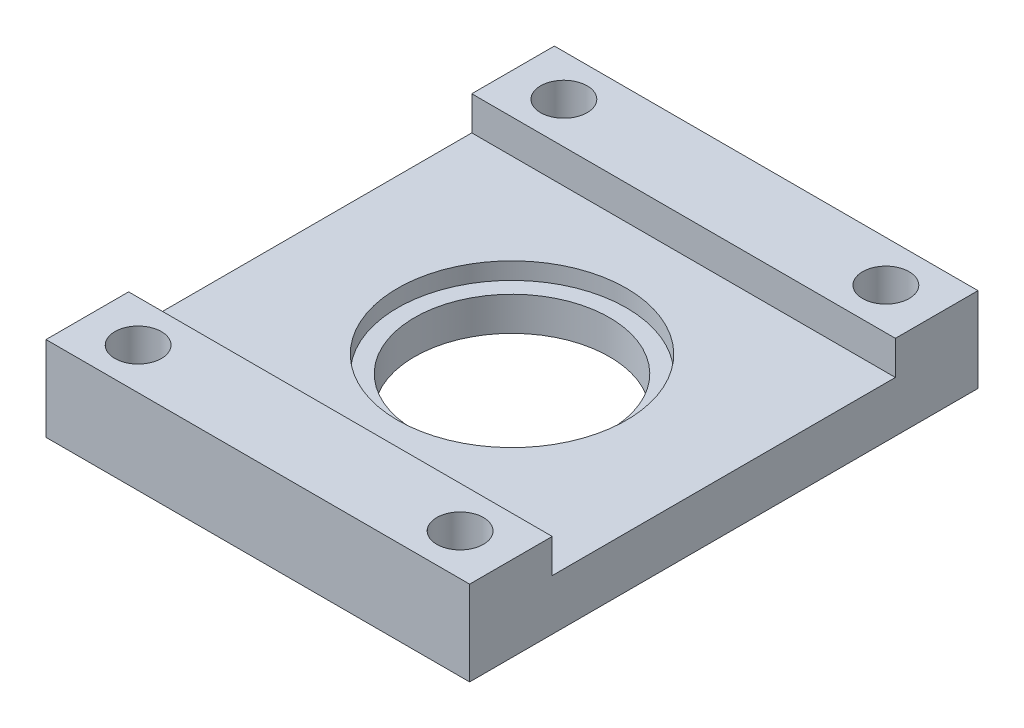
ISO-10303-21;
HEADER;
FILE_DESCRIPTION(('STEP AP214'),'2;1');
FILE_NAME('part.step','',(''),(''),'','','');
FILE_SCHEMA(('AUTOMOTIVE_DESIGN { 1 0 10303 214 1 1 1 1 }'));
ENDSEC;
DATA;
#1=APPLICATION_CONTEXT('core data for automotive mechanical design processes');
#2=APPLICATION_PROTOCOL_DEFINITION('international standard','automotive_design',2000,#1);
#3=PRODUCT_CONTEXT('',#1,'mechanical');
#4=PRODUCT('Part','Part','',(#3));
#5=PRODUCT_RELATED_PRODUCT_CATEGORY('part','',(#4));
#6=PRODUCT_DEFINITION_FORMATION('','',#4);
#7=PRODUCT_DEFINITION_CONTEXT('part definition',#1,'design');
#8=PRODUCT_DEFINITION('design','',#6,#7);
#9=PRODUCT_DEFINITION_SHAPE('','',#8);
#10=(LENGTH_UNIT() NAMED_UNIT(*) SI_UNIT(.MILLI.,.METRE.));
#11=(NAMED_UNIT(*) PLANE_ANGLE_UNIT() SI_UNIT($,.RADIAN.));
#12=(NAMED_UNIT(*) SI_UNIT($,.STERADIAN.) SOLID_ANGLE_UNIT());
#13=UNCERTAINTY_MEASURE_WITH_UNIT(LENGTH_MEASURE(1.E-05),#10,'distance_accuracy_value','');
#14=(GEOMETRIC_REPRESENTATION_CONTEXT(3) GLOBAL_UNCERTAINTY_ASSIGNED_CONTEXT((#13)) GLOBAL_UNIT_ASSIGNED_CONTEXT((#10,
#11,#12)) REPRESENTATION_CONTEXT('',''));
#15=CARTESIAN_POINT('',(0.,0.,0.));
#16=DIRECTION('',(0.,0.,1.));
#17=DIRECTION('',(1.,0.,0.));
#18=AXIS2_PLACEMENT_3D('',#15,#16,#17);
#19=CARTESIAN_POINT('',(31.75,0.,38.1));
#20=DIRECTION('',(0.,1.,0.));
#21=DIRECTION('',(0.,0.,1.));
#22=AXIS2_PLACEMENT_3D('',#19,#20,#21);
#23=CYLINDRICAL_SURFACE('',#22,14.605);
#24=CARTESIAN_POINT('',(31.75,0.,38.1));
#25=DIRECTION('',(0.,1.,0.));
#26=DIRECTION('',(0.,0.,1.));
#27=AXIS2_PLACEMENT_3D('',#24,#25,#26);
#28=CIRCLE('',#27,14.605);
#29=CARTESIAN_POINT('',(31.75,0.,52.705));
#30=VERTEX_POINT('',#29);
#31=EDGE_CURVE('E179',#30,#30,#28,.T.);
#32=CARTESIAN_POINT('',(31.75,5.08,38.1));
#33=DIRECTION('',(0.,1.,0.));
#34=DIRECTION('',(0.,0.,1.));
#35=AXIS2_PLACEMENT_3D('',#32,#33,#34);
#36=CIRCLE('',#35,14.605);
#37=CARTESIAN_POINT('',(31.75,5.08,52.705));
#38=VERTEX_POINT('',#37);
#39=EDGE_CURVE('E41',#38,#38,#36,.F.);
#40=CARTESIAN_POINT('',(31.75,0.,52.705));
#41=CARTESIAN_POINT('',(31.75,0.0529166666666667,52.705));
#42=CARTESIAN_POINT('',(31.75,0.105833333333333,52.705));
#43=CARTESIAN_POINT('',(31.75,0.211666666666667,52.705));
#44=CARTESIAN_POINT('',(31.75,0.264583333333333,52.705));
#45=CARTESIAN_POINT('',(31.75,0.370416666666667,52.705));
#46=CARTESIAN_POINT('',(31.75,0.423333333333333,52.705));
#47=CARTESIAN_POINT('',(31.75,0.529166666666666,52.705));
#48=CARTESIAN_POINT('',(31.75,0.582083333333333,52.705));
#49=CARTESIAN_POINT('',(31.75,0.687916666666667,52.705));
#50=CARTESIAN_POINT('',(31.75,0.740833333333333,52.705));
#51=CARTESIAN_POINT('',(31.75,0.846666666666666,52.705));
#52=CARTESIAN_POINT('',(31.75,0.899583333333333,52.705));
#53=CARTESIAN_POINT('',(31.75,1.00541666666667,52.705));
#54=CARTESIAN_POINT('',(31.75,1.05833333333333,52.705));
#55=CARTESIAN_POINT('',(31.75,1.16416666666667,52.705));
#56=CARTESIAN_POINT('',(31.75,1.21708333333333,52.705));
#57=CARTESIAN_POINT('',(31.75,1.32291666666667,52.705));
#58=CARTESIAN_POINT('',(31.75,1.37583333333333,52.705));
#59=CARTESIAN_POINT('',(31.75,1.48166666666667,52.705));
#60=CARTESIAN_POINT('',(31.75,1.53458333333333,52.705));
#61=CARTESIAN_POINT('',(31.75,1.64041666666667,52.705));
#62=CARTESIAN_POINT('',(31.75,1.69333333333333,52.705));
#63=CARTESIAN_POINT('',(31.75,1.79916666666667,52.705));
#64=CARTESIAN_POINT('',(31.75,1.85208333333333,52.705));
#65=CARTESIAN_POINT('',(31.75,1.95791666666667,52.705));
#66=CARTESIAN_POINT('',(31.75,2.01083333333333,52.705));
#67=CARTESIAN_POINT('',(31.75,2.11666666666667,52.705));
#68=CARTESIAN_POINT('',(31.75,2.16958333333333,52.705));
#69=CARTESIAN_POINT('',(31.75,2.27541666666667,52.705));
#70=CARTESIAN_POINT('',(31.75,2.32833333333333,52.705));
#71=CARTESIAN_POINT('',(31.75,2.43416666666667,52.705));
#72=CARTESIAN_POINT('',(31.75,2.48708333333333,52.705));
#73=CARTESIAN_POINT('',(31.75,2.59291666666667,52.705));
#74=CARTESIAN_POINT('',(31.75,2.64583333333333,52.705));
#75=CARTESIAN_POINT('',(31.75,2.75166666666667,52.705));
#76=CARTESIAN_POINT('',(31.75,2.80458333333333,52.705));
#77=CARTESIAN_POINT('',(31.75,2.91041666666667,52.705));
#78=CARTESIAN_POINT('',(31.75,2.96333333333333,52.705));
#79=CARTESIAN_POINT('',(31.75,3.06916666666667,52.705));
#80=CARTESIAN_POINT('',(31.75,3.12208333333333,52.705));
#81=CARTESIAN_POINT('',(31.75,3.22791666666667,52.705));
#82=CARTESIAN_POINT('',(31.75,3.28083333333333,52.705));
#83=CARTESIAN_POINT('',(31.75,3.38666666666667,52.705));
#84=CARTESIAN_POINT('',(31.75,3.43958333333333,52.705));
#85=CARTESIAN_POINT('',(31.75,3.54541666666667,52.705));
#86=CARTESIAN_POINT('',(31.75,3.59833333333333,52.705));
#87=CARTESIAN_POINT('',(31.75,3.70416666666667,52.705));
#88=CARTESIAN_POINT('',(31.75,3.75708333333333,52.705));
#89=CARTESIAN_POINT('',(31.75,3.86291666666667,52.705));
#90=CARTESIAN_POINT('',(31.75,3.91583333333333,52.705));
#91=CARTESIAN_POINT('',(31.75,4.02166666666666,52.705));
#92=CARTESIAN_POINT('',(31.75,4.07458333333333,52.705));
#93=CARTESIAN_POINT('',(31.75,4.18041666666667,52.705));
#94=CARTESIAN_POINT('',(31.75,4.23333333333333,52.705));
#95=CARTESIAN_POINT('',(31.75,4.33916666666666,52.705));
#96=CARTESIAN_POINT('',(31.75,4.39208333333333,52.705));
#97=CARTESIAN_POINT('',(31.75,4.49791666666667,52.705));
#98=CARTESIAN_POINT('',(31.75,4.55083333333333,52.705));
#99=CARTESIAN_POINT('',(31.75,4.65666666666666,52.705));
#100=CARTESIAN_POINT('',(31.75,4.70958333333333,52.705));
#101=CARTESIAN_POINT('',(31.75,4.81541666666666,52.705));
#102=CARTESIAN_POINT('',(31.75,4.86833333333333,52.705));
#103=CARTESIAN_POINT('',(31.75,4.97416666666667,52.705));
#104=CARTESIAN_POINT('',(31.75,5.02708333333333,52.705));
#105=CARTESIAN_POINT('',(31.75,5.08,52.705));
#106=B_SPLINE_CURVE_WITH_KNOTS('',3,(#40,#41,#42,#43,#44,#45,#46,#47,#48,#49,#50,#51,#52,#53,
#54,#55,#56,#57,#58,#59,#60,#61,#62,#63,#64,#65,#66,#67,#68,#69,#70,#71,#72,#73,#74,#75,#76,#77,
#78,#79,#80,#81,#82,#83,#84,#85,#86,#87,#88,#89,#90,#91,#92,#93,#94,#95,#96,#97,#98,#99,#100,
#101,#102,#103,#104,#105),.UNSPECIFIED.,.F.,.F.,(4,2,2,2,2,2,2,2,2,2,2,2,2,2,2,2,2,2,2,2,2,2,2,
2,2,2,2,2,2,2,2,2,4),(0.,0.15875,0.3175,0.47625,0.635,0.79375,0.9525,1.11125,1.27,1.42875,
1.5875,1.74625,1.905,2.06375,2.2225,2.38125,2.54,2.69875,2.8575,3.01625,3.175,3.33375,3.4925,
3.65125,3.81,3.96875,4.1275,4.28625,4.445,4.60375,4.7625,4.92125,5.08),.UNSPECIFIED.);
#107=EDGE_CURVE('BSEAM37',#30,#38,#106,.T.);
#108=ORIENTED_EDGE('',*,*,#31,.F.);
#109=ORIENTED_EDGE('',*,*,#39,.F.);
#110=ORIENTED_EDGE('',*,*,#107,.T.);
#111=ORIENTED_EDGE('',*,*,#107,.F.);
#112=EDGE_LOOP('',(#108,#110,#109,#111));
#113=FACE_BOUND('',#112,.T.);
#114=ADVANCED_FACE('F37',(#113),#23,.F.);
#115=CARTESIAN_POINT('',(0.,12.7,0.));
#116=DIRECTION('',(0.,1.,0.));
#117=DIRECTION('',(0.,0.,1.));
#118=AXIS2_PLACEMENT_3D('',#115,#116,#117);
#119=PLANE('',#118);
#120=CARTESIAN_POINT('',(55.88,12.7,6.19125));
#121=DIRECTION('',(0.,1.,0.));
#122=DIRECTION('',(0.,0.,1.));
#123=AXIS2_PLACEMENT_3D('',#120,#121,#122);
#124=CIRCLE('',#123,3.49250000000001);
#125=CARTESIAN_POINT('',(55.88,12.7,9.68375000000001));
#126=VERTEX_POINT('',#125);
#127=EDGE_CURVE('E230',#126,#126,#124,.T.);
#128=ORIENTED_EDGE('',*,*,#127,.F.);
#129=EDGE_LOOP('',(#128));
#130=FACE_BOUND('',#129,.T.);
#131=CARTESIAN_POINT('',(7.62,12.7,6.19125));
#132=DIRECTION('',(0.,1.,0.));
#133=DIRECTION('',(0.,0.,1.));
#134=AXIS2_PLACEMENT_3D('',#131,#132,#133);
#135=CIRCLE('',#134,3.4925);
#136=CARTESIAN_POINT('',(7.62,12.7,9.68375));
#137=VERTEX_POINT('',#136);
#138=EDGE_CURVE('E233',#137,#137,#135,.T.);
#139=ORIENTED_EDGE('',*,*,#138,.F.);
#140=EDGE_LOOP('',(#139));
#141=FACE_BOUND('',#140,.T.);
#142=DIRECTION('',(-1.,0.,0.));
#143=VECTOR('',#142,1.);
#144=CARTESIAN_POINT('',(0.,12.7,12.3825));
#145=LINE('',#144,#143);
#146=CARTESIAN_POINT('',(63.5,12.7,12.3825));
#147=VERTEX_POINT('',#146);
#148=CARTESIAN_POINT('',(0.,12.7,12.3825));
#149=VERTEX_POINT('',#148);
#150=EDGE_CURVE('E128',#147,#149,#145,.T.);
#151=ORIENTED_EDGE('',*,*,#150,.F.);
#152=DIRECTION('',(0.,0.,-1.));
#153=VECTOR('',#152,1.);
#154=CARTESIAN_POINT('',(63.5,12.7,0.));
#155=LINE('',#154,#153);
#156=CARTESIAN_POINT('',(63.5,12.7,0.));
#157=VERTEX_POINT('',#156);
#158=EDGE_CURVE('E141',#147,#157,#155,.T.);
#159=ORIENTED_EDGE('',*,*,#158,.T.);
#160=DIRECTION('',(-1.,0.,0.));
#161=VECTOR('',#160,1.);
#162=CARTESIAN_POINT('',(0.,12.7,0.));
#163=LINE('',#162,#161);
#164=CARTESIAN_POINT('',(0.,12.7,0.));
#165=VERTEX_POINT('',#164);
#166=EDGE_CURVE('E62',#157,#165,#163,.T.);
#167=ORIENTED_EDGE('',*,*,#166,.T.);
#168=DIRECTION('',(0.,0.,1.));
#169=VECTOR('',#168,1.);
#170=CARTESIAN_POINT('',(0.,12.7,0.));
#171=LINE('',#170,#169);
#172=EDGE_CURVE('E137',#165,#149,#171,.T.);
#173=ORIENTED_EDGE('',*,*,#172,.T.);
#174=EDGE_LOOP('',(#151,#159,#167,#173));
#175=FACE_BOUND('',#174,.T.);
#176=ADVANCED_FACE('F175',(#130,#141,#175),#119,.T.);
#177=CARTESIAN_POINT('',(0.,12.7,0.));
#178=DIRECTION('',(1.,0.,0.));
#179=DIRECTION('',(0.,0.,-1.));
#180=AXIS2_PLACEMENT_3D('',#177,#178,#179);
#181=PLANE('',#180);
#182=DIRECTION('',(0.,0.,1.));
#183=VECTOR('',#182,1.);
#184=CARTESIAN_POINT('',(0.,7.62,12.3825));
#185=LINE('',#184,#183);
#186=CARTESIAN_POINT('',(0.,7.62,12.3825));
#187=VERTEX_POINT('',#186);
#188=CARTESIAN_POINT('',(0.,7.62,63.8175));
#189=VERTEX_POINT('',#188);
#190=EDGE_CURVE('E119',#187,#189,#185,.T.);
#191=ORIENTED_EDGE('',*,*,#190,.F.);
#192=DIRECTION('',(0.,1.,0.));
#193=VECTOR('',#192,1.);
#194=CARTESIAN_POINT('',(0.,7.62,12.3825));
#195=LINE('',#194,#193);
#196=EDGE_CURVE('E151',#187,#149,#195,.T.);
#197=ORIENTED_EDGE('',*,*,#196,.T.);
#198=ORIENTED_EDGE('',*,*,#172,.F.);
#199=DIRECTION('',(0.,-1.,0.));
#200=VECTOR('',#199,1.);
#201=CARTESIAN_POINT('',(0.,12.7,0.));
#202=LINE('',#201,#200);
#203=CARTESIAN_POINT('',(0.,0.,0.));
#204=VERTEX_POINT('',#203);
#205=EDGE_CURVE('E146',#165,#204,#202,.T.);
#206=ORIENTED_EDGE('',*,*,#205,.T.);
#207=DIRECTION('',(0.,0.,1.));
#208=VECTOR('',#207,1.);
#209=CARTESIAN_POINT('',(0.,0.,0.));
#210=LINE('',#209,#208);
#211=CARTESIAN_POINT('',(0.,0.,76.2));
#212=VERTEX_POINT('',#211);
#213=EDGE_CURVE('E147',#204,#212,#210,.T.);
#214=ORIENTED_EDGE('',*,*,#213,.T.);
#215=DIRECTION('',(0.,-1.,0.));
#216=VECTOR('',#215,1.);
#217=CARTESIAN_POINT('',(0.,12.7,76.2));
#218=LINE('',#217,#216);
#219=CARTESIAN_POINT('',(0.,12.7,76.2));
#220=VERTEX_POINT('',#219);
#221=EDGE_CURVE('E11',#220,#212,#218,.T.);
#222=ORIENTED_EDGE('',*,*,#221,.F.);
#223=CARTESIAN_POINT('',(0.,12.7,63.8175));
#224=VERTEX_POINT('',#223);
#225=EDGE_CURVE('E90',#224,#220,#171,.T.);
#226=ORIENTED_EDGE('',*,*,#225,.F.);
#227=DIRECTION('',(0.,1.,0.));
#228=VECTOR('',#227,1.);
#229=CARTESIAN_POINT('',(0.,7.62,63.8175));
#230=LINE('',#229,#228);
#231=EDGE_CURVE('E53',#189,#224,#230,.T.);
#232=ORIENTED_EDGE('',*,*,#231,.F.);
#233=EDGE_LOOP('',(#191,#197,#198,#206,#214,#222,#226,#232));
#234=FACE_BOUND('',#233,.T.);
#235=ADVANCED_FACE('F39',(#234),#181,.F.);
#236=CARTESIAN_POINT('',(0.,12.7,76.2));
#237=DIRECTION('',(0.,0.,-1.));
#238=DIRECTION('',(-1.,0.,0.));
#239=AXIS2_PLACEMENT_3D('',#236,#237,#238);
#240=PLANE('',#239);
#241=DIRECTION('',(1.,0.,0.));
#242=VECTOR('',#241,1.);
#243=CARTESIAN_POINT('',(0.,0.,76.2));
#244=LINE('',#243,#242);
#245=CARTESIAN_POINT('',(63.5,0.,76.2));
#246=VERTEX_POINT('',#245);
#247=EDGE_CURVE('E150',#212,#246,#244,.T.);
#248=ORIENTED_EDGE('',*,*,#247,.T.);
#249=DIRECTION('',(0.,-1.,0.));
#250=VECTOR('',#249,1.);
#251=CARTESIAN_POINT('',(63.5,12.7,76.2));
#252=LINE('',#251,#250);
#253=CARTESIAN_POINT('',(63.5,12.7,76.2));
#254=VERTEX_POINT('',#253);
#255=EDGE_CURVE('E46',#254,#246,#252,.T.);
#256=ORIENTED_EDGE('',*,*,#255,.F.);
#257=DIRECTION('',(1.,0.,0.));
#258=VECTOR('',#257,1.);
#259=CARTESIAN_POINT('',(0.,12.7,76.2));
#260=LINE('',#259,#258);
#261=EDGE_CURVE('E139',#220,#254,#260,.T.);
#262=ORIENTED_EDGE('',*,*,#261,.F.);
#263=ORIENTED_EDGE('',*,*,#221,.T.);
#264=EDGE_LOOP('',(#248,#256,#262,#263));
#265=FACE_BOUND('',#264,.T.);
#266=ADVANCED_FACE('F249',(#265),#240,.F.);
#267=CARTESIAN_POINT('',(63.5,12.7,0.));
#268=DIRECTION('',(-1.,0.,0.));
#269=DIRECTION('',(0.,0.,1.));
#270=AXIS2_PLACEMENT_3D('',#267,#268,#269);
#271=PLANE('',#270);
#272=ORIENTED_EDGE('',*,*,#158,.F.);
#273=DIRECTION('',(0.,1.,0.));
#274=VECTOR('',#273,1.);
#275=CARTESIAN_POINT('',(63.5,7.62,12.3825));
#276=LINE('',#275,#274);
#277=CARTESIAN_POINT('',(63.5,7.62,12.3825));
#278=VERTEX_POINT('',#277);
#279=EDGE_CURVE('E132',#278,#147,#276,.T.);
#280=ORIENTED_EDGE('',*,*,#279,.F.);
#281=DIRECTION('',(0.,0.,-1.));
#282=VECTOR('',#281,1.);
#283=CARTESIAN_POINT('',(63.5,7.62,12.3825));
#284=LINE('',#283,#282);
#285=CARTESIAN_POINT('',(63.5,7.62,63.8175));
#286=VERTEX_POINT('',#285);
#287=EDGE_CURVE('E118',#286,#278,#284,.T.);
#288=ORIENTED_EDGE('',*,*,#287,.F.);
#289=DIRECTION('',(0.,1.,0.));
#290=VECTOR('',#289,1.);
#291=CARTESIAN_POINT('',(63.5,7.62,63.8175));
#292=LINE('',#291,#290);
#293=CARTESIAN_POINT('',(63.5,12.7,63.8175));
#294=VERTEX_POINT('',#293);
#295=EDGE_CURVE('E115',#286,#294,#292,.T.);
#296=ORIENTED_EDGE('',*,*,#295,.T.);
#297=EDGE_CURVE('E142',#254,#294,#155,.T.);
#298=ORIENTED_EDGE('',*,*,#297,.F.);
#299=ORIENTED_EDGE('',*,*,#255,.T.);
#300=DIRECTION('',(0.,0.,-1.));
#301=VECTOR('',#300,1.);
#302=CARTESIAN_POINT('',(63.5,0.,0.));
#303=LINE('',#302,#301);
#304=CARTESIAN_POINT('',(63.5,0.,0.));
#305=VERTEX_POINT('',#304);
#306=EDGE_CURVE('E153',#246,#305,#303,.T.);
#307=ORIENTED_EDGE('',*,*,#306,.T.);
#308=DIRECTION('',(0.,-1.,0.));
#309=VECTOR('',#308,1.);
#310=CARTESIAN_POINT('',(63.5,12.7,0.));
#311=LINE('',#310,#309);
#312=EDGE_CURVE('E157',#157,#305,#311,.T.);
#313=ORIENTED_EDGE('',*,*,#312,.F.);
#314=EDGE_LOOP('',(#272,#280,#288,#296,#298,#299,#307,#313));
#315=FACE_BOUND('',#314,.T.);
#316=ADVANCED_FACE('F165',(#315),#271,.F.);
#317=CARTESIAN_POINT('',(0.,12.7,0.));
#318=DIRECTION('',(0.,0.,1.));
#319=DIRECTION('',(1.,0.,0.));
#320=AXIS2_PLACEMENT_3D('',#317,#318,#319);
#321=PLANE('',#320);
#322=DIRECTION('',(-1.,0.,0.));
#323=VECTOR('',#322,1.);
#324=CARTESIAN_POINT('',(0.,0.,0.));
#325=LINE('',#324,#323);
#326=EDGE_CURVE('E83',#305,#204,#325,.T.);
#327=ORIENTED_EDGE('',*,*,#326,.T.);
#328=ORIENTED_EDGE('',*,*,#205,.F.);
#329=ORIENTED_EDGE('',*,*,#166,.F.);
#330=ORIENTED_EDGE('',*,*,#312,.T.);
#331=EDGE_LOOP('',(#327,#328,#329,#330));
#332=FACE_BOUND('',#331,.T.);
#333=ADVANCED_FACE('F172',(#332),#321,.F.);
#334=CARTESIAN_POINT('',(7.62,12.7,70.00875));
#335=DIRECTION('',(0.,1.,0.));
#336=DIRECTION('',(0.,0.,1.));
#337=AXIS2_PLACEMENT_3D('',#334,#335,#336);
#338=CIRCLE('',#337,3.4925);
#339=CARTESIAN_POINT('',(7.62,12.7,73.50125));
#340=VERTEX_POINT('',#339);
#341=EDGE_CURVE('E237',#340,#340,#338,.T.);
#342=ORIENTED_EDGE('',*,*,#341,.F.);
#343=EDGE_LOOP('',(#342));
#344=FACE_BOUND('',#343,.T.);
#345=CARTESIAN_POINT('',(55.88,12.7,70.00875));
#346=DIRECTION('',(0.,1.,0.));
#347=DIRECTION('',(0.,0.,1.));
#348=AXIS2_PLACEMENT_3D('',#345,#346,#347);
#349=CIRCLE('',#348,3.49250000000001);
#350=CARTESIAN_POINT('',(55.88,12.7,73.50125));
#351=VERTEX_POINT('',#350);
#352=EDGE_CURVE('E223',#351,#351,#349,.T.);
#353=ORIENTED_EDGE('',*,*,#352,.F.);
#354=EDGE_LOOP('',(#353));
#355=FACE_BOUND('',#354,.T.);
#356=DIRECTION('',(1.,0.,0.));
#357=VECTOR('',#356,1.);
#358=CARTESIAN_POINT('',(0.,12.7,63.8175));
#359=LINE('',#358,#357);
#360=EDGE_CURVE('E177',#224,#294,#359,.T.);
#361=ORIENTED_EDGE('',*,*,#360,.F.);
#362=ORIENTED_EDGE('',*,*,#225,.T.);
#363=ORIENTED_EDGE('',*,*,#261,.T.);
#364=ORIENTED_EDGE('',*,*,#297,.T.);
#365=EDGE_LOOP('',(#361,#362,#363,#364));
#366=FACE_BOUND('',#365,.T.);
#367=ADVANCED_FACE('F190',(#344,#355,#366),#119,.T.);
#368=CARTESIAN_POINT('',(0.,0.,0.));
#369=DIRECTION('',(0.,1.,0.));
#370=DIRECTION('',(0.,0.,1.));
#371=AXIS2_PLACEMENT_3D('',#368,#369,#370);
#372=PLANE('',#371);
#373=CARTESIAN_POINT('',(55.88,0.,6.19125));
#374=DIRECTION('',(0.,1.,0.));
#375=DIRECTION('',(0.,0.,1.));
#376=AXIS2_PLACEMENT_3D('',#373,#374,#375);
#377=CIRCLE('',#376,3.49250000000001);
#378=CARTESIAN_POINT('',(55.88,0.,9.68375000000001));
#379=VERTEX_POINT('',#378);
#380=EDGE_CURVE('E234',#379,#379,#377,.T.);
#381=ORIENTED_EDGE('',*,*,#380,.T.);
#382=EDGE_LOOP('',(#381));
#383=FACE_BOUND('',#382,.T.);
#384=CARTESIAN_POINT('',(7.62,0.,70.00875));
#385=DIRECTION('',(0.,1.,0.));
#386=DIRECTION('',(0.,0.,1.));
#387=AXIS2_PLACEMENT_3D('',#384,#385,#386);
#388=CIRCLE('',#387,3.4925);
#389=CARTESIAN_POINT('',(7.62,0.,73.50125));
#390=VERTEX_POINT('',#389);
#391=EDGE_CURVE('E226',#390,#390,#388,.T.);
#392=ORIENTED_EDGE('',*,*,#391,.T.);
#393=EDGE_LOOP('',(#392));
#394=FACE_BOUND('',#393,.T.);
#395=CARTESIAN_POINT('',(55.88,0.,70.00875));
#396=DIRECTION('',(0.,1.,0.));
#397=DIRECTION('',(0.,0.,1.));
#398=AXIS2_PLACEMENT_3D('',#395,#396,#397);
#399=CIRCLE('',#398,3.49250000000001);
#400=CARTESIAN_POINT('',(55.88,0.,73.50125));
#401=VERTEX_POINT('',#400);
#402=EDGE_CURVE('E227',#401,#401,#399,.T.);
#403=ORIENTED_EDGE('',*,*,#402,.T.);
#404=EDGE_LOOP('',(#403));
#405=FACE_BOUND('',#404,.T.);
#406=CARTESIAN_POINT('',(7.62,0.,6.19125));
#407=DIRECTION('',(0.,1.,0.));
#408=DIRECTION('',(0.,0.,1.));
#409=AXIS2_PLACEMENT_3D('',#406,#407,#408);
#410=CIRCLE('',#409,3.4925);
#411=CARTESIAN_POINT('',(7.62,0.,9.68375));
#412=VERTEX_POINT('',#411);
#413=EDGE_CURVE('E242',#412,#412,#410,.T.);
#414=ORIENTED_EDGE('',*,*,#413,.T.);
#415=EDGE_LOOP('',(#414));
#416=FACE_BOUND('',#415,.T.);
#417=ORIENTED_EDGE('',*,*,#31,.T.);
#418=EDGE_LOOP('',(#417));
#419=FACE_BOUND('',#418,.T.);
#420=ORIENTED_EDGE('',*,*,#213,.F.);
#421=ORIENTED_EDGE('',*,*,#326,.F.);
#422=ORIENTED_EDGE('',*,*,#306,.F.);
#423=ORIENTED_EDGE('',*,*,#247,.F.);
#424=EDGE_LOOP('',(#420,#421,#422,#423));
#425=FACE_BOUND('',#424,.T.);
#426=ADVANCED_FACE('F170',(#383,#394,#405,#416,#419,#425),#372,.F.);
#427=CARTESIAN_POINT('',(0.,7.62,12.3825));
#428=DIRECTION('',(0.,0.,-1.));
#429=DIRECTION('',(-1.,0.,0.));
#430=AXIS2_PLACEMENT_3D('',#427,#428,#429);
#431=PLANE('',#430);
#432=ORIENTED_EDGE('',*,*,#150,.T.);
#433=ORIENTED_EDGE('',*,*,#196,.F.);
#434=DIRECTION('',(-1.,0.,0.));
#435=VECTOR('',#434,1.);
#436=CARTESIAN_POINT('',(0.,7.62,12.3825));
#437=LINE('',#436,#435);
#438=EDGE_CURVE('E125',#278,#187,#437,.T.);
#439=ORIENTED_EDGE('',*,*,#438,.F.);
#440=ORIENTED_EDGE('',*,*,#279,.T.);
#441=EDGE_LOOP('',(#432,#433,#439,#440));
#442=FACE_BOUND('',#441,.T.);
#443=ADVANCED_FACE('F182',(#442),#431,.F.);
#444=CARTESIAN_POINT('',(0.,7.62,63.8175));
#445=DIRECTION('',(0.,0.,1.));
#446=DIRECTION('',(1.,0.,0.));
#447=AXIS2_PLACEMENT_3D('',#444,#445,#446);
#448=PLANE('',#447);
#449=ORIENTED_EDGE('',*,*,#360,.T.);
#450=ORIENTED_EDGE('',*,*,#295,.F.);
#451=DIRECTION('',(1.,0.,0.));
#452=VECTOR('',#451,1.);
#453=CARTESIAN_POINT('',(0.,7.62,63.8175));
#454=LINE('',#453,#452);
#455=EDGE_CURVE('E111',#189,#286,#454,.T.);
#456=ORIENTED_EDGE('',*,*,#455,.F.);
#457=ORIENTED_EDGE('',*,*,#231,.T.);
#458=EDGE_LOOP('',(#449,#450,#456,#457));
#459=FACE_BOUND('',#458,.T.);
#460=ADVANCED_FACE('F113',(#459),#448,.F.);
#461=CARTESIAN_POINT('',(0.,7.62,0.));
#462=DIRECTION('',(0.,1.,0.));
#463=DIRECTION('',(0.,0.,1.));
#464=AXIS2_PLACEMENT_3D('',#461,#462,#463);
#465=PLANE('',#464);
#466=CARTESIAN_POINT('',(31.75,7.62,38.1));
#467=DIRECTION('',(0.,1.,0.));
#468=DIRECTION('',(0.,0.,1.));
#469=AXIS2_PLACEMENT_3D('',#466,#467,#468);
#470=CIRCLE('',#469,17.145);
#471=CARTESIAN_POINT('',(31.75,7.62,55.245));
#472=VERTEX_POINT('',#471);
#473=EDGE_CURVE('E216',#472,#472,#470,.T.);
#474=ORIENTED_EDGE('',*,*,#473,.F.);
#475=EDGE_LOOP('',(#474));
#476=FACE_BOUND('',#475,.T.);
#477=ORIENTED_EDGE('',*,*,#190,.T.);
#478=ORIENTED_EDGE('',*,*,#455,.T.);
#479=ORIENTED_EDGE('',*,*,#287,.T.);
#480=ORIENTED_EDGE('',*,*,#438,.T.);
#481=EDGE_LOOP('',(#477,#478,#479,#480));
#482=FACE_BOUND('',#481,.T.);
#483=ADVANCED_FACE('F123',(#476,#482),#465,.T.);
#484=CARTESIAN_POINT('',(7.62,0.,6.19125));
#485=DIRECTION('',(0.,1.,0.));
#486=DIRECTION('',(0.,0.,1.));
#487=AXIS2_PLACEMENT_3D('',#484,#485,#486);
#488=CYLINDRICAL_SURFACE('',#487,3.4925);
#489=ORIENTED_EDGE('',*,*,#413,.F.);
#490=EDGE_LOOP('',(#489));
#491=FACE_BOUND('',#490,.T.);
#492=ORIENTED_EDGE('',*,*,#138,.T.);
#493=EDGE_LOOP('',(#492));
#494=FACE_BOUND('',#493,.T.);
#495=ADVANCED_FACE('F205',(#491,#494),#488,.F.);
#496=CARTESIAN_POINT('',(55.88,0.,70.00875));
#497=DIRECTION('',(0.,1.,0.));
#498=DIRECTION('',(0.,0.,1.));
#499=AXIS2_PLACEMENT_3D('',#496,#497,#498);
#500=CYLINDRICAL_SURFACE('',#499,3.49250000000001);
#501=ORIENTED_EDGE('',*,*,#402,.F.);
#502=EDGE_LOOP('',(#501));
#503=FACE_BOUND('',#502,.T.);
#504=ORIENTED_EDGE('',*,*,#352,.T.);
#505=EDGE_LOOP('',(#504));
#506=FACE_BOUND('',#505,.T.);
#507=ADVANCED_FACE('F212',(#503,#506),#500,.F.);
#508=CARTESIAN_POINT('',(7.62,0.,70.00875));
#509=DIRECTION('',(0.,1.,0.));
#510=DIRECTION('',(0.,0.,1.));
#511=AXIS2_PLACEMENT_3D('',#508,#509,#510);
#512=CYLINDRICAL_SURFACE('',#511,3.4925);
#513=ORIENTED_EDGE('',*,*,#391,.F.);
#514=EDGE_LOOP('',(#513));
#515=FACE_BOUND('',#514,.T.);
#516=ORIENTED_EDGE('',*,*,#341,.T.);
#517=EDGE_LOOP('',(#516));
#518=FACE_BOUND('',#517,.T.);
#519=ADVANCED_FACE('F267',(#515,#518),#512,.F.);
#520=CARTESIAN_POINT('',(55.88,0.,6.19125));
#521=DIRECTION('',(0.,1.,0.));
#522=DIRECTION('',(0.,0.,1.));
#523=AXIS2_PLACEMENT_3D('',#520,#521,#522);
#524=CYLINDRICAL_SURFACE('',#523,3.49250000000001);
#525=ORIENTED_EDGE('',*,*,#380,.F.);
#526=EDGE_LOOP('',(#525));
#527=FACE_BOUND('',#526,.T.);
#528=ORIENTED_EDGE('',*,*,#127,.T.);
#529=EDGE_LOOP('',(#528));
#530=FACE_BOUND('',#529,.T.);
#531=ADVANCED_FACE('F273',(#527,#530),#524,.F.);
#532=CARTESIAN_POINT('',(31.75,5.08,38.1));
#533=DIRECTION('',(0.,1.,0.));
#534=DIRECTION('',(0.,0.,1.));
#535=AXIS2_PLACEMENT_3D('',#532,#533,#534);
#536=PLANE('',#535);
#537=CARTESIAN_POINT('',(31.75,5.08,38.1));
#538=DIRECTION('',(0.,1.,0.));
#539=DIRECTION('',(0.,0.,1.));
#540=AXIS2_PLACEMENT_3D('',#537,#538,#539);
#541=CIRCLE('',#540,17.145);
#542=CARTESIAN_POINT('',(31.75,5.08,55.245));
#543=VERTEX_POINT('',#542);
#544=EDGE_CURVE('E218',#543,#543,#541,.T.);
#545=ORIENTED_EDGE('',*,*,#544,.T.);
#546=EDGE_LOOP('',(#545));
#547=FACE_BOUND('',#546,.T.);
#548=ORIENTED_EDGE('',*,*,#39,.T.);
#549=EDGE_LOOP('',(#548));
#550=FACE_BOUND('',#549,.T.);
#551=ADVANCED_FACE('F281',(#547,#550),#536,.T.);
#552=CARTESIAN_POINT('',(31.75,5.08,38.1));
#553=DIRECTION('',(0.,1.,0.));
#554=DIRECTION('',(0.,0.,1.));
#555=AXIS2_PLACEMENT_3D('',#552,#553,#554);
#556=CYLINDRICAL_SURFACE('',#555,17.145);
#557=ORIENTED_EDGE('',*,*,#544,.F.);
#558=EDGE_LOOP('',(#557));
#559=FACE_BOUND('',#558,.T.);
#560=ORIENTED_EDGE('',*,*,#473,.T.);
#561=EDGE_LOOP('',(#560));
#562=FACE_BOUND('',#561,.T.);
#563=ADVANCED_FACE('F278',(#559,#562),#556,.F.);
#564=CLOSED_SHELL('',(#114,#176,#235,#266,#316,#333,#367,#426,#443,#460,#483,#495,#507,#519,
#531,#551,#563));
#565=MANIFOLD_SOLID_BREP('B2',#564);
#566=ADVANCED_BREP_SHAPE_REPRESENTATION('',(#18,#565),#14);
#567=SHAPE_DEFINITION_REPRESENTATION(#9,#566);
ENDSEC;
END-ISO-10303-21;
